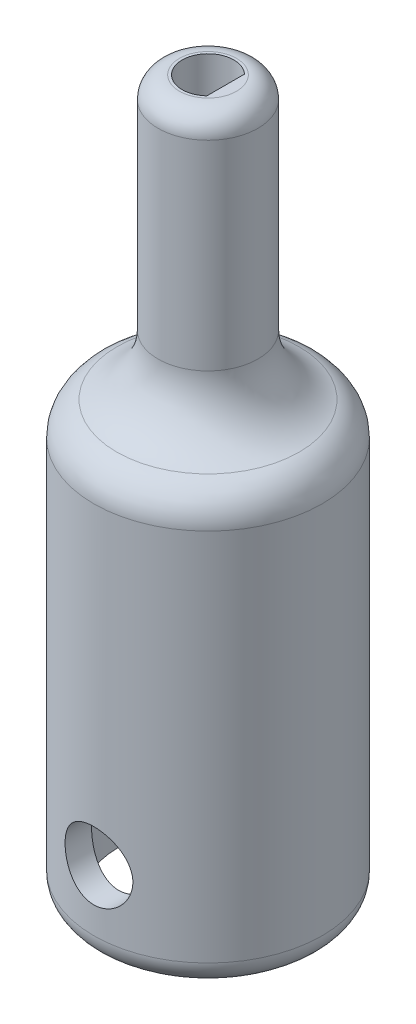
ISO-10303-21;
HEADER;
FILE_DESCRIPTION(('STEP AP214'),'2;1');
FILE_NAME('part.step','',(''),(''),'','','');
FILE_SCHEMA(('AUTOMOTIVE_DESIGN { 1 0 10303 214 1 1 1 1 }'));
ENDSEC;
DATA;
#1=APPLICATION_CONTEXT('core data for automotive mechanical design processes');
#2=APPLICATION_PROTOCOL_DEFINITION('international standard','automotive_design',2000,#1);
#3=PRODUCT_CONTEXT('',#1,'mechanical');
#4=PRODUCT('Part','Part','',(#3));
#5=PRODUCT_RELATED_PRODUCT_CATEGORY('part','',(#4));
#6=PRODUCT_DEFINITION_FORMATION('','',#4);
#7=PRODUCT_DEFINITION_CONTEXT('part definition',#1,'design');
#8=PRODUCT_DEFINITION('design','',#6,#7);
#9=PRODUCT_DEFINITION_SHAPE('','',#8);
#10=(LENGTH_UNIT() NAMED_UNIT(*) SI_UNIT(.MILLI.,.METRE.));
#11=(NAMED_UNIT(*) PLANE_ANGLE_UNIT() SI_UNIT($,.RADIAN.));
#12=(NAMED_UNIT(*) SI_UNIT($,.STERADIAN.) SOLID_ANGLE_UNIT());
#13=UNCERTAINTY_MEASURE_WITH_UNIT(LENGTH_MEASURE(1.E-05),#10,'distance_accuracy_value','');
#14=(GEOMETRIC_REPRESENTATION_CONTEXT(3) GLOBAL_UNCERTAINTY_ASSIGNED_CONTEXT((#13)) GLOBAL_UNIT_ASSIGNED_CONTEXT((#10,
#11,#12)) REPRESENTATION_CONTEXT('',''));
#15=CARTESIAN_POINT('',(0.,0.,0.));
#16=DIRECTION('',(0.,0.,1.));
#17=DIRECTION('',(1.,0.,0.));
#18=AXIS2_PLACEMENT_3D('',#15,#16,#17);
#19=CARTESIAN_POINT('',(0.,100.,6.99999999999999));
#20=DIRECTION('',(0.,-1.,0.));
#21=DIRECTION('',(0.,0.,-1.));
#22=AXIS2_PLACEMENT_3D('',#19,#20,#21);
#23=PLANE('',#22);
#24=CARTESIAN_POINT('',(0.,100.,0.));
#25=DIRECTION('',(0.,-1.,0.));
#26=DIRECTION('',(0.,0.,-1.));
#27=AXIS2_PLACEMENT_3D('',#24,#25,#26);
#28=CIRCLE('',#27,3.99999999999999);
#29=CARTESIAN_POINT('',(0.,100.,-3.99999999999998));
#30=VERTEX_POINT('',#29);
#31=EDGE_CURVE('E50',#30,#30,#28,.F.);
#32=ORIENTED_EDGE('',*,*,#31,.T.);
#33=EDGE_LOOP('',(#32));
#34=FACE_BOUND('',#33,.T.);
#35=DIRECTION('',(0.,0.,1.));
#36=VECTOR('',#35,1.);
#37=CARTESIAN_POINT('',(2.4765,100.,0.));
#38=LINE('',#37,#36);
#39=CARTESIAN_POINT('',(2.4765,100.,-2.63964543073496));
#40=VERTEX_POINT('',#39);
#41=CARTESIAN_POINT('',(2.4765,100.,2.63964543073498));
#42=VERTEX_POINT('',#41);
#43=EDGE_CURVE('E57',#40,#42,#38,.T.);
#44=ORIENTED_EDGE('',*,*,#43,.T.);
#45=CARTESIAN_POINT('',(0.,100.,0.));
#46=DIRECTION('',(0.,1.,0.));
#47=DIRECTION('',(0.,0.,1.));
#48=AXIS2_PLACEMENT_3D('',#45,#46,#47);
#49=CIRCLE('',#48,3.6195);
#50=EDGE_CURVE('E78',#40,#42,#49,.T.);
#51=ORIENTED_EDGE('',*,*,#50,.F.);
#52=EDGE_LOOP('',(#44,#51));
#53=FACE_BOUND('',#52,.T.);
#54=ADVANCED_FACE('F41',(#34,#53),#23,.F.);
#55=CARTESIAN_POINT('',(0.,12.,-16.));
#56=DIRECTION('',(0.,0.,1.));
#57=DIRECTION('',(1.,0.,0.));
#58=AXIS2_PLACEMENT_3D('',#55,#56,#57);
#59=CYLINDRICAL_SURFACE('',#58,4.75);
#60=CARTESIAN_POINT('',(4.75,12.,-11.5623310798472));
#61=CARTESIAN_POINT('',(4.75000071288731,12.1280869020408,-11.5623304254209));
#62=CARTESIAN_POINT('',(4.7448149214157,12.2561643708243,-11.5644651777453));
#63=CARTESIAN_POINT('',(4.72412714696736,12.5113876507321,-11.5729317396174));
#64=CARTESIAN_POINT('',(4.70862187780732,12.6385331520326,-11.579264886119));
#65=CARTESIAN_POINT('',(4.66746528251825,12.890842395101,-11.5959155784243));
#66=CARTESIAN_POINT('',(4.64181854969211,13.0160070074045,-11.6062313203687));
#67=CARTESIAN_POINT('',(4.5806267377214,13.2635769294969,-11.6305176545544));
#68=CARTESIAN_POINT('',(4.54507773323256,13.3859811241899,-11.6444896960506));
#69=CARTESIAN_POINT('',(4.46452814518694,13.6268252220373,-11.6756089732222));
#70=CARTESIAN_POINT('',(4.41955524155441,13.745275582572,-11.6927468929798));
#71=CARTESIAN_POINT('',(4.3204767636278,13.9778736978506,-11.7297175492613));
#72=CARTESIAN_POINT('',(4.26636777388495,14.0920198238979,-11.7495512930536));
#73=CARTESIAN_POINT('',(4.0909401057549,14.4269597626762,-11.8122668719216));
#74=CARTESIAN_POINT('',(3.95646219100749,14.6404288729158,-11.8583867822014));
#75=CARTESIAN_POINT('',(3.64908567349391,15.0521791024374,-11.9566439611443));
#76=CARTESIAN_POINT('',(3.47469277628032,15.2492944236039,-12.0089612145274));
#77=CARTESIAN_POINT('',(3.09554664890728,15.612334674879,-12.1122318297992));
#78=CARTESIAN_POINT('',(2.89078673473612,15.7782527199496,-12.163184888496));
#79=CARTESIAN_POINT('',(2.44788929688681,16.0797764043863,-12.2601358027252));
#80=CARTESIAN_POINT('',(2.20883297897854,16.2141147550826,-12.3058971774678));
#81=CARTESIAN_POINT('',(1.70946510282705,16.4401870767963,-12.3851323728162));
#82=CARTESIAN_POINT('',(1.44916116891328,16.5319362518462,-12.4186105775302));
#83=CARTESIAN_POINT('',(0.92688988664031,16.6661358096678,-12.4682237398679));
#84=CARTESIAN_POINT('',(0.665503968170618,16.7105848968573,-12.485059495406));
#85=CARTESIAN_POINT('',(0.138476755386228,16.7553337079339,-12.5020094614591));
#86=CARTESIAN_POINT('',(-0.127163088412745,16.7556481733575,-12.5021292553223));
#87=CARTESIAN_POINT('',(-0.640808155699206,16.7132691446938,-12.4860757458235));
#88=CARTESIAN_POINT('',(-0.889023882168279,16.6727587926702,-12.4707295003568));
#89=CARTESIAN_POINT('',(-1.37482944554291,16.5535605229271,-12.426558868485));
#90=CARTESIAN_POINT('',(-1.61241852653627,16.474869894007,-12.3977335249276));
#91=CARTESIAN_POINT('',(-2.07437231147144,16.2805619822532,-12.3289238801589));
#92=CARTESIAN_POINT('',(-2.29849173022588,16.1644196593062,-12.2887820027463));
#93=CARTESIAN_POINT('',(-2.72462156537307,15.8989749639529,-12.2013860830293));
#94=CARTESIAN_POINT('',(-2.92662471598682,15.7496617425375,-12.1541297154645));
#95=CARTESIAN_POINT('',(-3.31562610016878,15.4116599420667,-12.0540185807176));
#96=CARTESIAN_POINT('',(-3.50099973099311,15.2211479581578,-12.0009980273846));
#97=CARTESIAN_POINT('',(-3.83778994222189,14.8114440339029,-11.8975828128784));
#98=CARTESIAN_POINT('',(-3.98919751674903,14.5922445115801,-11.8471888508412));
#99=CARTESIAN_POINT('',(-4.25697821457645,14.1248120318153,-11.7536712994445));
#100=CARTESIAN_POINT('',(-4.37245180238396,13.8760211339278,-11.7107447047096));
#101=CARTESIAN_POINT('',(-4.55924307505487,13.3604625638912,-11.63930511263));
#102=CARTESIAN_POINT('',(-4.6305861259122,13.0937053166707,-11.6107838369191));
#103=CARTESIAN_POINT('',(-4.72334557574618,12.5658736413503,-11.5733479765148));
#104=CARTESIAN_POINT('',(-4.74734974893488,12.305326576646,-11.5634187493694));
#105=CARTESIAN_POINT('',(-4.75223220617383,11.7837952454612,-11.5614151455071));
#106=CARTESIAN_POINT('',(-4.73312168952577,11.5228111101093,-11.5693361320885));
#107=CARTESIAN_POINT('',(-4.65466480957691,11.021296446075,-11.6011079451493));
#108=CARTESIAN_POINT('',(-4.5973469962478,10.7803916830837,-11.6241547837493));
#109=CARTESIAN_POINT('',(-4.44667314135973,10.3117397219485,-11.6826189055805));
#110=CARTESIAN_POINT('',(-4.35330959666755,10.0839952745574,-11.7180387641832));
#111=CARTESIAN_POINT('',(-4.12918416347568,9.63846025915535,-11.7989192486121));
#112=CARTESIAN_POINT('',(-3.99713208257815,9.42138029042404,-11.8447112161964));
#113=CARTESIAN_POINT('',(-3.70078128083387,9.01156214612273,-11.9406231277081));
#114=CARTESIAN_POINT('',(-3.53647048674256,8.81883312873706,-11.9907446880968));
#115=CARTESIAN_POINT('',(-3.16739381048829,8.45001095864917,-12.0936554251922));
#116=CARTESIAN_POINT('',(-2.96068480944307,8.27583043258979,-12.1464046574282));
#117=CARTESIAN_POINT('',(-2.63019992960076,8.04237114448173,-12.2206748400947));
#118=CARTESIAN_POINT('',(-2.51656379211843,7.96915267835017,-12.2446349535557));
#119=CARTESIAN_POINT('',(-2.28313914021767,7.83250286763495,-12.290296303524));
#120=CARTESIAN_POINT('',(-2.16335329195171,7.76906732871977,-12.3119985067819));
#121=CARTESIAN_POINT('',(-1.9186988342614,7.6526548424002,-12.3524871050923));
#122=CARTESIAN_POINT('',(-1.79384323116981,7.59965294857478,-12.371280431556));
#123=CARTESIAN_POINT('',(-1.53969226563594,7.50441870759753,-12.4054736153239));
#124=CARTESIAN_POINT('',(-1.41039879218218,7.46218184124033,-12.4208748962533));
#125=CARTESIAN_POINT('',(-1.14831363151065,7.38888430085658,-12.447840204455));
#126=CARTESIAN_POINT('',(-1.01552260170574,7.35782154236937,-12.4594049473783));
#127=CARTESIAN_POINT('',(-0.747473649748549,7.30719885306018,-12.4783544591522));
#128=CARTESIAN_POINT('',(-0.612215874736863,7.28763823843761,-12.4857394764858));
#129=CARTESIAN_POINT('',(-0.348499213010656,7.26106062624677,-12.4957955503732));
#130=CARTESIAN_POINT('',(-0.220118272166205,7.25336256573471,-12.4987224321008));
#131=CARTESIAN_POINT('',(0.0369201903970496,7.24840399515189,-12.5006063281555));
#132=CARTESIAN_POINT('',(0.16557779091261,7.25114701270687,-12.4995620007689));
#133=CARTESIAN_POINT('',(0.422089221076055,7.26704685728794,-12.4935299945745));
#134=CARTESIAN_POINT('',(0.549943417527919,7.28019852169471,-12.4885442706744));
#135=CARTESIAN_POINT('',(0.804010374388073,7.3167802014355,-12.4747649877962));
#136=CARTESIAN_POINT('',(0.930222504047261,7.34021405293404,-12.4659700076447));
#137=CARTESIAN_POINT('',(1.17680322833963,7.39639272731648,-12.4450808238561));
#138=CARTESIAN_POINT('',(1.29723841813188,7.42887937077359,-12.4330784356576));
#139=CARTESIAN_POINT('',(1.53488438084163,7.50309546015174,-12.405985163339));
#140=CARTESIAN_POINT('',(1.65209400085175,7.54482816384496,-12.3908931907723));
#141=CARTESIAN_POINT('',(1.99771775784392,7.68339029683333,-12.3415189105825));
#142=CARTESIAN_POINT('',(2.22033027729863,7.79363055773921,-12.3031200975229));
#143=CARTESIAN_POINT('',(2.65361303882081,8.05193544379701,-12.2171729879033));
#144=CARTESIAN_POINT('',(2.86337265277402,8.20140939297999,-12.1693050079323));
#145=CARTESIAN_POINT('',(3.25568144515618,8.5317359240797,-12.0702737213519));
#146=CARTESIAN_POINT('',(3.4382207660578,8.71259982245923,-12.0191092305069));
#147=CARTESIAN_POINT('',(3.78120797202441,9.11244823309505,-11.9158013491762));
#148=CARTESIAN_POINT('',(3.93990805238812,9.33297382373113,-11.8637567589751));
#149=CARTESIAN_POINT('',(4.14844117642505,9.68236733780885,-11.7917707985346));
#150=CARTESIAN_POINT('',(4.21306556059525,9.80201770982947,-11.7687758185953));
#151=CARTESIAN_POINT('',(4.33197597476051,10.0468059288026,-11.7255270049279));
#152=CARTESIAN_POINT('',(4.38626638227117,10.1719414244731,-11.7052720115868));
#153=CARTESIAN_POINT('',(4.48675686236488,10.4340170835188,-11.6671362488721));
#154=CARTESIAN_POINT('',(4.53233262376227,10.5712257271603,-11.6494522825914));
#155=CARTESIAN_POINT('',(4.61086600075328,10.8496428451747,-11.6185927345741));
#156=CARTESIAN_POINT('',(4.64382935515268,10.9908494689283,-11.6054151026887));
#157=CARTESIAN_POINT('',(4.69673911656839,11.2760086939846,-11.5841036638395));
#158=CARTESIAN_POINT('',(4.71669006258537,11.4199603197201,-11.5759680981466));
#159=CARTESIAN_POINT('',(4.74331921351786,11.7092788074202,-11.5650825370967));
#160=CARTESIAN_POINT('',(4.7499991910071,11.8546454777738,-11.5623318224978));
#161=CARTESIAN_POINT('',(4.75,12.,-11.5623310798472));
#162=B_SPLINE_CURVE_WITH_KNOTS('',3,(#60,#61,#62,#63,#64,#65,#66,#67,#68,#69,#70,#71,#72,#73,
#74,#75,#76,#77,#78,#79,#80,#81,#82,#83,#84,#85,#86,#87,#88,#89,#90,#91,#92,#93,#94,#95,#96,#97,
#98,#99,#100,#101,#102,#103,#104,#105,#106,#107,#108,#109,#110,#111,#112,#113,#114,#115,#116,
#117,#118,#119,#120,#121,#122,#123,#124,#125,#126,#127,#128,#129,#130,#131,#132,#133,#134,#135,
#136,#137,#138,#139,#140,#141,#142,#143,#144,#145,#146,#147,#148,#149,#150,#151,#152,#153,#154,
#155,#156,#157,#158,#159,#160,#161),.UNSPECIFIED.,.T.,.F.,(4,2,2,2,2,2,2,2,2,2,2,2,2,2,2,2,2,2,
2,2,2,2,2,2,2,2,2,2,2,2,2,2,2,2,2,2,2,2,2,2,2,2,2,2,2,2,2,2,2,2,4),(0.,0.384122452894618,
0.768367286126422,1.15243828497943,1.53666175002388,1.91977210573404,2.303026002422,
3.06898568409038,3.87051838444686,4.67222777081633,5.50205633862985,6.3315884352899,
7.12447650700119,7.91709974317398,8.66947340979513,9.42190051066893,10.1853713906225,
10.9490923430524,11.7585800260723,12.5682820864396,13.3968701160663,14.2249814341312,
15.0064100040571,15.7876356165525,16.5303750953206,17.2732692631547,18.0444883789579,
18.8159966857218,19.6379673188466,20.049424237456,20.460704254667,20.8709886447164,
21.2811005108379,21.691135833408,22.1011467769794,22.486602729165,22.8721889231711,
23.2575839887654,23.6431229632038,24.018628665334,24.394266884771,25.1449219904715,
25.9275039487996,26.7103686258297,27.5359298888771,27.9492557495771,28.3624061321638,
28.7987220165448,29.2348391348787,29.670804044948,30.1067107202385),.UNSPECIFIED.);
#163=CARTESIAN_POINT('',(4.75,12.,-11.5623310798472));
#164=VERTEX_POINT('',#163);
#165=EDGE_CURVE('E104',#164,#164,#162,.T.);
#166=ORIENTED_EDGE('',*,*,#165,.T.);
#167=EDGE_LOOP('',(#166));
#168=FACE_BOUND('',#167,.T.);
#169=CARTESIAN_POINT('',(0.,16.75,-16.));
#170=CARTESIAN_POINT('',(-0.26070567225133,16.749996505252,-15.9999975519953));
#171=CARTESIAN_POINT('',(-0.521446746347982,16.7284653470622,-15.9935669595937));
#172=CARTESIAN_POINT('',(-1.03534382961395,16.643108860596,-15.9685419064033));
#173=CARTESIAN_POINT('',(-1.28849741549849,16.5792701675057,-15.9499436018973));
#174=CARTESIAN_POINT('',(-1.77973256832612,16.4116121514142,-15.9026224603528));
#175=CARTESIAN_POINT('',(-2.01783551561075,16.3078510975144,-15.8739143842874));
#176=CARTESIAN_POINT('',(-2.47326350270938,16.0635304859457,-15.8093624290536));
#177=CARTESIAN_POINT('',(-2.69058590229262,15.9229662607822,-15.7735176449238));
#178=CARTESIAN_POINT('',(-3.10440680678848,15.6048556123274,-15.6973909801758));
#179=CARTESIAN_POINT('',(-3.30023708479862,15.4264613780274,-15.6570195975014));
#180=CARTESIAN_POINT('',(-3.65968676646443,15.0395621287212,-15.5769276396439));
#181=CARTESIAN_POINT('',(-3.82330088512709,14.8310521830057,-15.5372071722202));
#182=CARTESIAN_POINT('',(-4.11716450848363,14.3842178866056,-15.4619706119089));
#183=CARTESIAN_POINT('',(-4.24660302867083,14.1453396714778,-15.4265659133499));
#184=CARTESIAN_POINT('',(-4.4632005458223,13.647986272125,-15.3653051205624));
#185=CARTESIAN_POINT('',(-4.55036945816789,13.3895157002369,-15.3394467873381));
#186=CARTESIAN_POINT('',(-4.67755245924913,12.8678086738504,-15.3011383581976));
#187=CARTESIAN_POINT('',(-4.71879654659294,12.6048983743032,-15.2883393281079));
#188=CARTESIAN_POINT('',(-4.75679940907518,12.0756023982679,-15.2765601689967));
#189=CARTESIAN_POINT('',(-4.75356871171795,11.809217559143,-15.2775767697143));
#190=CARTESIAN_POINT('',(-4.70368083478542,11.2904958328331,-15.293004451461));
#191=CARTESIAN_POINT('',(-4.65855928412517,11.0379948453399,-15.3069418575055));
#192=CARTESIAN_POINT('',(-4.52864948410571,10.5443213349658,-15.3458752241279));
#193=CARTESIAN_POINT('',(-4.44385739326104,10.3031499116694,-15.3708722556488));
#194=CARTESIAN_POINT('',(-4.23587077025775,9.83520132596099,-15.4294900694923));
#195=CARTESIAN_POINT('',(-4.11217428778469,9.60866184394449,-15.4632224901811));
#196=CARTESIAN_POINT('',(-3.83023914738897,9.17903839104181,-15.5354560108813));
#197=CARTESIAN_POINT('',(-3.67199226801561,8.97596002046942,-15.5739582449503));
#198=CARTESIAN_POINT('',(-3.31779954943057,8.59030709279969,-15.65331921222));
#199=CARTESIAN_POINT('',(-3.12057779220426,8.40890897641407,-15.6942099593235));
#200=CARTESIAN_POINT('',(-2.69800471257564,8.08149065903697,-15.7723452641626));
#201=CARTESIAN_POINT('',(-2.47265169328005,7.93547259375371,-15.8095896017027));
#202=CARTESIAN_POINT('',(-1.99810619878083,7.68226479314308,-15.8765639236345));
#203=CARTESIAN_POINT('',(-1.74876948190873,7.57533128827071,-15.906243947348));
#204=CARTESIAN_POINT('',(-1.23456606273388,7.40526135569564,-15.9543855050516));
#205=CARTESIAN_POINT('',(-0.969703620285577,7.3421129749336,-15.9728501006113));
#206=CARTESIAN_POINT('',(-0.441972179887557,7.26335340474478,-15.9959981723728));
#207=CARTESIAN_POINT('',(-0.179361120122493,7.24614732482477,-16.001143814837));
#208=CARTESIAN_POINT('',(0.345010859131308,7.25529698660518,-15.9984274349598));
#209=CARTESIAN_POINT('',(0.6067718850658,7.28164704518619,-15.9905671096115));
#210=CARTESIAN_POINT('',(1.11602587705413,7.37586935368988,-15.963024189988));
#211=CARTESIAN_POINT('',(1.36370614656555,7.44281382860126,-15.9436059271776));
#212=CARTESIAN_POINT('',(1.84426867680972,7.6152122540717,-15.8951895518284));
#213=CARTESIAN_POINT('',(2.07714916860728,7.72067079787818,-15.8661902966851));
#214=CARTESIAN_POINT('',(2.52740235735572,7.96980820108433,-15.8007977780301));
#215=CARTESIAN_POINT('',(2.74430003031691,8.11430415522023,-15.7642509164929));
#216=CARTESIAN_POINT('',(3.15131425239062,8.43641854794157,-15.6879625552353));
#217=CARTESIAN_POINT('',(3.34142420510143,8.61404511991454,-15.6482202724222));
#218=CARTESIAN_POINT('',(3.69646044519739,9.0048685154705,-15.5682533225203));
#219=CARTESIAN_POINT('',(3.8602527122982,9.21910447484586,-15.528061641048));
#220=CARTESIAN_POINT('',(4.14963592215259,9.67289356112625,-15.4532502110458));
#221=CARTESIAN_POINT('',(4.27522794889976,9.91244596937613,-15.418630304421));
#222=CARTESIAN_POINT('',(4.48377155212868,10.4092487527008,-15.3592826735014));
#223=CARTESIAN_POINT('',(4.56692867767943,10.6664068369479,-15.3345073949411));
#224=CARTESIAN_POINT('',(4.68852081695,11.1919455059316,-15.2977738553872));
#225=CARTESIAN_POINT('',(4.72697075435237,11.4603223147435,-15.2858113174847));
#226=CARTESIAN_POINT('',(4.75705699216789,11.9889170225052,-15.2764729540938));
#227=CARTESIAN_POINT('',(4.75053917233241,12.2490210892304,-15.2785219387526));
#228=CARTESIAN_POINT('',(4.69526883350326,12.7642464555219,-15.2955963824404));
#229=CARTESIAN_POINT('',(4.64651794090663,13.0193679465804,-15.3106213417642));
#230=CARTESIAN_POINT('',(4.50934571485169,13.5144373863661,-15.3515730206474));
#231=CARTESIAN_POINT('',(4.42140352609225,13.7545298087871,-15.3773678366717));
#232=CARTESIAN_POINT('',(4.2087173753822,14.2167436944162,-15.4369310074602));
#233=CARTESIAN_POINT('',(4.08396648353459,14.4388617635877,-15.4707008634293));
#234=CARTESIAN_POINT('',(3.79597895299047,14.8674120748939,-15.5439163797675));
#235=CARTESIAN_POINT('',(3.63152566195092,15.0729994262672,-15.5835218151215));
#236=CARTESIAN_POINT('',(3.27100354910397,15.4542580760204,-15.6631594560472));
#237=CARTESIAN_POINT('',(3.07492658310786,15.6299216439655,-15.7031917690679));
#238=CARTESIAN_POINT('',(2.65000924997735,15.9513160166139,-15.7805364476621));
#239=CARTESIAN_POINT('',(2.42039606417665,16.0960541506291,-15.8177391660193));
#240=CARTESIAN_POINT('',(1.93898955829397,16.3446660238058,-15.8839288844265));
#241=CARTESIAN_POINT('',(1.68720707973512,16.4485596029533,-15.9129198713559));
#242=CARTESIAN_POINT('',(1.1979150483489,16.6027938590764,-15.9567666019116));
#243=CARTESIAN_POINT('',(0.961992664332182,16.6578487795024,-15.9728467644627));
#244=CARTESIAN_POINT('',(0.484056374283711,16.7314505652029,-15.9944637603522));
#245=CARTESIAN_POINT('',(0.242043444579143,16.7500032445817,-16.0000022727679));
#246=CARTESIAN_POINT('',(0.,16.75,-16.));
#247=B_SPLINE_CURVE_WITH_KNOTS('',3,(#169,#170,#171,#172,#173,#174,#175,#176,#177,#178,#179,
#180,#181,#182,#183,#184,#185,#186,#187,#188,#189,#190,#191,#192,#193,#194,#195,#196,#197,#198,
#199,#200,#201,#202,#203,#204,#205,#206,#207,#208,#209,#210,#211,#212,#213,#214,#215,#216,#217,
#218,#219,#220,#221,#222,#223,#224,#225,#226,#227,#228,#229,#230,#231,#232,#233,#234,#235,#236,
#237,#238,#239,#240,#241,#242,#243,#244,#245,#246),.UNSPECIFIED.,.T.,.F.,(4,2,2,2,2,2,2,2,2,2,2,
2,2,2,2,2,2,2,2,2,2,2,2,2,2,2,2,2,2,2,2,2,2,2,2,2,2,2,4),(0.,0.781228080531369,1.56270306620222,
2.34304174243283,3.12347943165774,3.9237180006734,4.72408773796652,5.54202167345277,
6.35976364939135,7.15503388870292,7.95011588501446,8.71715610449882,9.48427061548251,
10.2617193097326,11.039353204052,11.8487529919314,12.6582016268671,13.4728654993288,
14.2873068860988,15.0730832487222,15.8587570928816,16.6271178870783,17.3955703471121,
18.1815548651501,18.9677325927114,19.7818280454392,20.5959003947364,21.4059911353541,
22.2158113823112,22.9925930274858,23.7693447601032,24.53685004932,25.3044999274402,
26.0995991652974,26.8949034966066,27.7128123439618,28.5303234048915,29.2557439904769,
29.9810490211687),.UNSPECIFIED.);
#248=CARTESIAN_POINT('',(0.,16.75,-16.));
#249=VERTEX_POINT('',#248);
#250=EDGE_CURVE('E113',#249,#249,#247,.T.);
#251=ORIENTED_EDGE('',*,*,#250,.F.);
#252=EDGE_LOOP('',(#251));
#253=FACE_BOUND('',#252,.T.);
#254=ADVANCED_FACE('F130',(#168,#253),#59,.F.);
#255=CARTESIAN_POINT('',(0.,2.41146554148117,0.));
#256=DIRECTION('',(0.,-1.,0.));
#257=DIRECTION('',(0.,0.,-1.));
#258=AXIS2_PLACEMENT_3D('',#255,#256,#257);
#259=CYLINDRICAL_SURFACE('',#258,16.);
#260=CARTESIAN_POINT('',(0.,3.5,0.));
#261=DIRECTION('',(0.,1.,0.));
#262=DIRECTION('',(0.,0.,1.));
#263=AXIS2_PLACEMENT_3D('',#260,#261,#262);
#264=CIRCLE('',#263,16.);
#265=CARTESIAN_POINT('',(0.,3.5,16.));
#266=VERTEX_POINT('',#265);
#267=EDGE_CURVE('E11',#266,#266,#264,.T.);
#268=ORIENTED_EDGE('',*,*,#267,.T.);
#269=EDGE_LOOP('',(#268));
#270=FACE_BOUND('',#269,.T.);
#271=CARTESIAN_POINT('',(0.,55.923303169378,0.));
#272=DIRECTION('',(0.,1.,0.));
#273=DIRECTION('',(0.,0.,1.));
#274=AXIS2_PLACEMENT_3D('',#271,#272,#273);
#275=CIRCLE('',#274,16.);
#276=CARTESIAN_POINT('',(0.,55.923303169378,16.));
#277=VERTEX_POINT('',#276);
#278=EDGE_CURVE('E149',#277,#277,#275,.F.);
#279=ORIENTED_EDGE('',*,*,#278,.T.);
#280=EDGE_LOOP('',(#279));
#281=FACE_BOUND('',#280,.T.);
#282=ORIENTED_EDGE('',*,*,#250,.T.);
#283=EDGE_LOOP('',(#282));
#284=FACE_BOUND('',#283,.T.);
#285=CARTESIAN_POINT('',(4.75,12.,15.2786615905975));
#286=CARTESIAN_POINT('',(4.74999641854889,11.739580090942,15.2786645173645));
#287=CARTESIAN_POINT('',(4.7285107697107,11.4791246564979,15.2853926080842));
#288=CARTESIAN_POINT('',(4.64335141783791,10.9658193412336,15.3114732297201));
#289=CARTESIAN_POINT('',(4.57966294581232,10.7129721553348,15.330830180103));
#290=CARTESIAN_POINT('',(4.41244372211199,10.2223879306895,15.3797871680349));
#291=CARTESIAN_POINT('',(4.3089782126668,9.98462688778896,15.4093704244432));
#292=CARTESIAN_POINT('',(4.06535541836592,9.52978103918896,15.4754241552602));
#293=CARTESIAN_POINT('',(3.92519288913005,9.3126991948113,15.5118956138557));
#294=CARTESIAN_POINT('',(3.60750462533337,8.89864638159834,15.5888838768353));
#295=CARTESIAN_POINT('',(3.42904051428651,8.7024110008328,15.6294854992601));
#296=CARTESIAN_POINT('',(3.04182670085581,8.34216827237017,15.7094340333983));
#297=CARTESIAN_POINT('',(2.83307319036506,8.17816498313663,15.7487807865844));
#298=CARTESIAN_POINT('',(2.38598645410466,7.88386021171852,15.8227480588905));
#299=CARTESIAN_POINT('',(2.14714064681258,7.75430690480543,15.8572569780342));
#300=CARTESIAN_POINT('',(1.64985490681774,7.53748864288187,15.9166761248566));
#301=CARTESIAN_POINT('',(1.39141912130537,7.45021476608734,15.9415883773916));
#302=CARTESIAN_POINT('',(0.869983468262371,7.322861767209,15.9784071517873));
#303=CARTESIAN_POINT('',(0.607314972659609,7.28152747403075,15.9906588903769));
#304=CARTESIAN_POINT('',(0.0785047391751729,7.24326005680844,16.0019910678025));
#305=CARTESIAN_POINT('',(-0.187636272543758,7.24631779372414,16.0010742176719));
#306=CARTESIAN_POINT('',(-0.70703795205952,7.29590104801031,15.9864174221246));
#307=CARTESIAN_POINT('',(-0.960441435579815,7.34106764372439,15.9730783761365));
#308=CARTESIAN_POINT('',(-1.45589494946967,7.4713691060813,15.9355618093429));
#309=CARTESIAN_POINT('',(-1.69794426562789,7.55650648330846,15.9113836077291));
#310=CARTESIAN_POINT('',(-2.16707213906577,7.76526459952473,15.8543472469233));
#311=CARTESIAN_POINT('',(-2.39394664070741,7.88931642590784,15.8213925129053));
#312=CARTESIAN_POINT('',(-2.82409629737654,8.17204213414847,15.7503041145677));
#313=CARTESIAN_POINT('',(-3.02736592972959,8.3307240932843,15.7121692427958));
#314=CARTESIAN_POINT('',(-3.41264640960057,8.68527029371763,15.6331062812896));
#315=CARTESIAN_POINT('',(-3.59356389794358,8.88231283836387,15.5921270949345));
#316=CARTESIAN_POINT('',(-3.92009230342504,9.30434298736925,15.513257816819));
#317=CARTESIAN_POINT('',(-4.06569986143258,9.52933324739497,15.4753680191881));
#318=CARTESIAN_POINT('',(-4.31858398471056,10.003700224204,15.4067269107937));
#319=CARTESIAN_POINT('',(-4.42549479859777,10.2532826391908,15.3760446305243));
#320=CARTESIAN_POINT('',(-4.59544870698651,10.7680300153456,15.326114547779));
#321=CARTESIAN_POINT('',(-4.65850576393499,11.0331899876428,15.3068631061633));
#322=CARTESIAN_POINT('',(-4.73693430858106,11.5611770988712,15.2827708782258));
#323=CARTESIAN_POINT('',(-4.75396478109954,11.8237351501568,15.2774290053089));
#324=CARTESIAN_POINT('',(-4.7444834999416,12.3479630086215,15.2803765482744));
#325=CARTESIAN_POINT('',(-4.7179776909966,12.6096329321827,15.2886641031049));
#326=CARTESIAN_POINT('',(-4.62365233727752,13.1177901232036,15.3174456386117));
#327=CARTESIAN_POINT('',(-4.55689414663765,13.3644939807784,15.337625743379));
#328=CARTESIAN_POINT('',(-4.38518600677873,13.8431847028981,15.3875952093814));
#329=CARTESIAN_POINT('',(-4.28023024458843,14.0751693211306,15.4173860331136));
#330=CARTESIAN_POINT('',(-4.03193811599809,14.5246026467549,15.4841975033031));
#331=CARTESIAN_POINT('',(-3.88766230382657,14.7415064539444,15.5213881417126));
#332=CARTESIAN_POINT('',(-3.56594588634719,15.1486314868138,15.5984403431881));
#333=CARTESIAN_POINT('',(-3.38849750944012,15.3388464415673,15.6383025307323));
#334=CARTESIAN_POINT('',(-2.99768568992657,15.6944140993997,15.7179840887381));
#335=CARTESIAN_POINT('',(-2.7832397719804,15.8585923886911,15.7577477560257));
#336=CARTESIAN_POINT('',(-2.32889779786996,16.1486574181371,15.8312701059571));
#337=CARTESIAN_POINT('',(-2.08900302488176,16.2745460876852,15.8650290911381));
#338=CARTESIAN_POINT('',(-1.59217911743711,16.4832448811888,15.92252983886));
#339=CARTESIAN_POINT('',(-1.33539490236169,16.5663783157513,15.9463465176887));
#340=CARTESIAN_POINT('',(-0.810668835250017,16.6880482175411,15.9816100486085));
#341=CARTESIAN_POINT('',(-0.542730125036346,16.726597155753,15.9930603597077));
#342=CARTESIAN_POINT('',(-0.0141651106964231,16.7570714225938,16.0020950205076));
#343=CARTESIAN_POINT('',(0.246355468576461,16.7507016506211,16.0001864312102));
#344=CARTESIAN_POINT('',(0.762454544364329,16.6955834582788,15.9839080902851));
#345=CARTESIAN_POINT('',(1.01803331038797,16.6468373556627,15.9695390201776));
#346=CARTESIAN_POINT('',(1.51443061257727,16.5093973009892,15.9300947041604));
#347=CARTESIAN_POINT('',(1.75537430340128,16.4211210132153,15.9051315329862));
#348=CARTESIAN_POINT('',(2.21915834770546,16.2074993987947,15.8470824093003));
#349=CARTESIAN_POINT('',(2.44199575432977,16.0821480534064,15.8139951380755));
#350=CARTESIAN_POINT('',(2.87087104192842,15.7933526154101,15.7418837847465));
#351=CARTESIAN_POINT('',(3.07615838393368,15.6288327427385,15.7027054935308));
#352=CARTESIAN_POINT('',(3.45678250850066,15.2683176333224,15.6233329304477));
#353=CARTESIAN_POINT('',(3.63211071507647,15.0723134150377,15.5831383714346));
#354=CARTESIAN_POINT('',(3.95294104513819,14.6475683065621,15.5049142454633));
#355=CARTESIAN_POINT('',(4.09743050109273,14.4180427534805,15.4669812961403));
#356=CARTESIAN_POINT('',(4.34559860700621,13.9368693638951,15.3991046133859));
#357=CARTESIAN_POINT('',(4.44929760118009,13.6852326321374,15.3691568997308));
#358=CARTESIAN_POINT('',(4.60317188552907,13.1963879816347,15.3237232087146));
#359=CARTESIAN_POINT('',(4.65808304802854,12.9607794999069,15.3069824340255));
#360=CARTESIAN_POINT('',(4.73149530289636,12.4834567690756,15.2844513085357));
#361=CARTESIAN_POINT('',(4.75000332460453,12.2417436908561,15.2786588737259));
#362=CARTESIAN_POINT('',(4.75,12.,15.2786615905975));
#363=B_SPLINE_CURVE_WITH_KNOTS('',3,(#285,#286,#287,#288,#289,#290,#291,#292,#293,#294,#295,
#296,#297,#298,#299,#300,#301,#302,#303,#304,#305,#306,#307,#308,#309,#310,#311,#312,#313,#314,
#315,#316,#317,#318,#319,#320,#321,#322,#323,#324,#325,#326,#327,#328,#329,#330,#331,#332,#333,
#334,#335,#336,#337,#338,#339,#340,#341,#342,#343,#344,#345,#346,#347,#348,#349,#350,#351,#352,
#353,#354,#355,#356,#357,#358,#359,#360,#361,#362),.UNSPECIFIED.,.T.,.F.,(4,2,2,2,2,2,2,2,2,2,2,
2,2,2,2,2,2,2,2,2,2,2,2,2,2,2,2,2,2,2,2,2,2,2,2,2,2,2,4),(0.,0.780368259325989,1.56100975494018,
2.34037626906025,3.11985422349443,3.92121288680706,4.72267238764021,5.54033088681321,
6.35781676886239,7.15237167852797,7.94676301454554,8.71637388280035,9.48603309715861,
10.2645389284776,11.0432265362218,11.8513344453354,12.6595192018474,13.4751546684174,
14.290530328581,15.0760980392268,15.8615584921862,16.6271624385556,17.392882944585,
18.178803265023,18.9649079405045,19.7799794136835,20.5950098090405,21.4037828985514,
22.2123297067609,22.9903577057638,23.7683431535663,24.5382957851863,25.3083734791039,
26.1027147004491,26.8972829272856,27.7148987998643,28.5321063684634,29.2566478353603,
29.9810513723972),.UNSPECIFIED.);
#364=CARTESIAN_POINT('',(4.75,12.,15.2786615905975));
#365=VERTEX_POINT('',#364);
#366=EDGE_CURVE('E103',#365,#365,#363,.T.);
#367=ORIENTED_EDGE('',*,*,#366,.T.);
#368=EDGE_LOOP('',(#367));
#369=FACE_BOUND('',#368,.T.);
#370=ADVANCED_FACE('F118',(#270,#281,#284,#369),#259,.T.);
#371=CARTESIAN_POINT('',(0.,69.,0.));
#372=DIRECTION('',(0.,-1.,0.));
#373=DIRECTION('',(0.,0.,-1.));
#374=AXIS2_PLACEMENT_3D('',#371,#372,#373);
#375=TOROIDAL_SURFACE('',#374,16.,8.99999999999999);
#376=CARTESIAN_POINT('',(0.,60.5935520374572,0.));
#377=DIRECTION('',(0.,1.,0.));
#378=DIRECTION('',(0.,0.,1.));
#379=AXIS2_PLACEMENT_3D('',#376,#377,#378);
#380=CIRCLE('',#379,12.7857142857143);
#381=CARTESIAN_POINT('',(0.,60.5935520374572,12.7857142857143));
#382=VERTEX_POINT('',#381);
#383=EDGE_CURVE('E153',#382,#382,#380,.T.);
#384=ORIENTED_EDGE('',*,*,#383,.T.);
#385=EDGE_LOOP('',(#384));
#386=FACE_BOUND('',#385,.T.);
#387=CARTESIAN_POINT('',(0.,69.,0.));
#388=DIRECTION('',(0.,-1.,0.));
#389=DIRECTION('',(0.,0.,-1.));
#390=AXIS2_PLACEMENT_3D('',#387,#388,#389);
#391=CIRCLE('',#390,6.99999999999999);
#392=CARTESIAN_POINT('',(0.,69.,-6.99999999999999));
#393=VERTEX_POINT('',#392);
#394=EDGE_CURVE('E99',#393,#393,#391,.T.);
#395=ORIENTED_EDGE('',*,*,#394,.T.);
#396=EDGE_LOOP('',(#395));
#397=FACE_BOUND('',#396,.T.);
#398=ADVANCED_FACE('F173',(#386,#397),#375,.F.);
#399=CARTESIAN_POINT('',(0.,2.41146554148117,0.));
#400=DIRECTION('',(0.,-1.,0.));
#401=DIRECTION('',(0.,0.,-1.));
#402=AXIS2_PLACEMENT_3D('',#399,#400,#401);
#403=CYLINDRICAL_SURFACE('',#402,6.99999999999999);
#404=CARTESIAN_POINT('',(0.,97.,0.));
#405=DIRECTION('',(0.,-1.,0.));
#406=DIRECTION('',(0.,0.,-1.));
#407=AXIS2_PLACEMENT_3D('',#404,#405,#406);
#408=CIRCLE('',#407,6.99999999999999);
#409=CARTESIAN_POINT('',(0.,97.,-6.99999999999998));
#410=VERTEX_POINT('',#409);
#411=EDGE_CURVE('E157',#410,#410,#408,.T.);
#412=ORIENTED_EDGE('',*,*,#411,.T.);
#413=EDGE_LOOP('',(#412));
#414=FACE_BOUND('',#413,.T.);
#415=ORIENTED_EDGE('',*,*,#394,.F.);
#416=EDGE_LOOP('',(#415));
#417=FACE_BOUND('',#416,.T.);
#418=ADVANCED_FACE('F128',(#414,#417),#403,.T.);
#419=CARTESIAN_POINT('',(4.75,12.,11.5623310798472));
#420=CARTESIAN_POINT('',(4.75000071288731,11.8719130979592,11.5623304254209));
#421=CARTESIAN_POINT('',(4.7448149214157,11.7438356291757,11.5644651777453));
#422=CARTESIAN_POINT('',(4.72412714696736,11.4886123492679,11.5729317396174));
#423=CARTESIAN_POINT('',(4.70862187780732,11.3614668479674,11.579264886119));
#424=CARTESIAN_POINT('',(4.66746528251825,11.109157604899,11.5959155784243));
#425=CARTESIAN_POINT('',(4.64181854969211,10.9839929925955,11.6062313203687));
#426=CARTESIAN_POINT('',(4.5806267377214,10.7364230705032,11.6305176545544));
#427=CARTESIAN_POINT('',(4.54507773323256,10.6140188758101,11.6444896960506));
#428=CARTESIAN_POINT('',(4.46452814518694,10.3731747779627,11.6756089732222));
#429=CARTESIAN_POINT('',(4.41955524155441,10.254724417428,11.6927468929798));
#430=CARTESIAN_POINT('',(4.3204767636278,10.0221263021494,11.7297175492613));
#431=CARTESIAN_POINT('',(4.26636777388495,9.90798017610215,11.7495512930536));
#432=CARTESIAN_POINT('',(4.0909401057549,9.57304023732385,11.8122668719216));
#433=CARTESIAN_POINT('',(3.95646219100749,9.3595711270842,11.8583867822014));
#434=CARTESIAN_POINT('',(3.64908567349391,8.94782089756259,11.9566439611443));
#435=CARTESIAN_POINT('',(3.47469277628032,8.7507055763961,12.0089612145274));
#436=CARTESIAN_POINT('',(3.09554664890728,8.38766532512102,12.1122318297992));
#437=CARTESIAN_POINT('',(2.89078673473612,8.22174728005036,12.163184888496));
#438=CARTESIAN_POINT('',(2.44788929688681,7.92022359561367,12.2601358027252));
#439=CARTESIAN_POINT('',(2.20883297897854,7.7858852449174,12.3058971774678));
#440=CARTESIAN_POINT('',(1.70946510282705,7.55981292320373,12.3851323728162));
#441=CARTESIAN_POINT('',(1.44916116891328,7.46806374815382,12.4186105775302));
#442=CARTESIAN_POINT('',(0.926889886640312,7.33386419033223,12.4682237398679));
#443=CARTESIAN_POINT('',(0.66550396817062,7.28941510314273,12.485059495406));
#444=CARTESIAN_POINT('',(0.138476755386228,7.24466629206613,12.5020094614591));
#445=CARTESIAN_POINT('',(-0.127163088412746,7.24435182664248,12.5021292553223));
#446=CARTESIAN_POINT('',(-0.640808155699208,7.2867308553062,12.4860757458235));
#447=CARTESIAN_POINT('',(-0.88902388216828,7.32724120732982,12.4707295003568));
#448=CARTESIAN_POINT('',(-1.37482944554291,7.44643947707288,12.426558868485));
#449=CARTESIAN_POINT('',(-1.61241852653627,7.52513010599296,12.3977335249276));
#450=CARTESIAN_POINT('',(-2.07437231147144,7.71943801774683,12.3289238801589));
#451=CARTESIAN_POINT('',(-2.29849173022588,7.83558034069377,12.2887820027463));
#452=CARTESIAN_POINT('',(-2.72462156537308,8.10102503604711,12.2013860830293));
#453=CARTESIAN_POINT('',(-2.92662471598682,8.25033825746246,12.1541297154645));
#454=CARTESIAN_POINT('',(-3.31562610016878,8.58834005793329,12.0540185807176));
#455=CARTESIAN_POINT('',(-3.50099973099311,8.77885204184221,12.0009980273846));
#456=CARTESIAN_POINT('',(-3.83778994222189,9.18855596609708,11.8975828128784));
#457=CARTESIAN_POINT('',(-3.98919751674904,9.40775548841991,11.8471888508412));
#458=CARTESIAN_POINT('',(-4.25697821457645,9.87518796818466,11.7536712994445));
#459=CARTESIAN_POINT('',(-4.37245180238396,10.1239788660722,11.7107447047096));
#460=CARTESIAN_POINT('',(-4.55924307505487,10.6395374361089,11.63930511263));
#461=CARTESIAN_POINT('',(-4.6305861259122,10.9062946833293,11.6107838369191));
#462=CARTESIAN_POINT('',(-4.72334557574618,11.4341263586497,11.5733479765148));
#463=CARTESIAN_POINT('',(-4.74734974893488,11.694673423354,11.5634187493694));
#464=CARTESIAN_POINT('',(-4.75223220617383,12.2162047545388,11.5614151455071));
#465=CARTESIAN_POINT('',(-4.73312168952577,12.4771888898907,11.5693361320885));
#466=CARTESIAN_POINT('',(-4.65466480957691,12.978703553925,11.6011079451493));
#467=CARTESIAN_POINT('',(-4.5973469962478,13.2196083169163,11.6241547837493));
#468=CARTESIAN_POINT('',(-4.44667314135973,13.6882602780515,11.6826189055805));
#469=CARTESIAN_POINT('',(-4.35330959666755,13.9160047254426,11.7180387641832));
#470=CARTESIAN_POINT('',(-4.12918416347568,14.3615397408447,11.7989192486121));
#471=CARTESIAN_POINT('',(-3.99713208257815,14.578619709576,11.8447112161964));
#472=CARTESIAN_POINT('',(-3.70078128083387,14.9884378538773,11.9406231277081));
#473=CARTESIAN_POINT('',(-3.53647048674256,15.181166871263,11.9907446880968));
#474=CARTESIAN_POINT('',(-3.16739381048829,15.5499890413508,12.0936554251922));
#475=CARTESIAN_POINT('',(-2.96068480944307,15.7241695674102,12.1464046574282));
#476=CARTESIAN_POINT('',(-2.63019992960076,15.9576288555183,12.2206748400947));
#477=CARTESIAN_POINT('',(-2.51656379211843,16.0308473216498,12.2446349535557));
#478=CARTESIAN_POINT('',(-2.28313914021766,16.1674971323651,12.290296303524));
#479=CARTESIAN_POINT('',(-2.16335329195171,16.2309326712802,12.3119985067819));
#480=CARTESIAN_POINT('',(-1.9186988342614,16.3473451575998,12.3524871050923));
#481=CARTESIAN_POINT('',(-1.79384323116981,16.4003470514252,12.371280431556));
#482=CARTESIAN_POINT('',(-1.53969226563595,16.4955812924025,12.4054736153239));
#483=CARTESIAN_POINT('',(-1.41039879218218,16.5378181587597,12.4208748962533));
#484=CARTESIAN_POINT('',(-1.14831363151065,16.6111156991434,12.447840204455));
#485=CARTESIAN_POINT('',(-1.01552260170574,16.6421784576306,12.4594049473783));
#486=CARTESIAN_POINT('',(-0.747473649748548,16.6928011469398,12.4783544591522));
#487=CARTESIAN_POINT('',(-0.612215874736863,16.7123617615624,12.4857394764858));
#488=CARTESIAN_POINT('',(-0.348499213010656,16.7389393737532,12.4957955503732));
#489=CARTESIAN_POINT('',(-0.220118272166204,16.7466374342653,12.4987224321008));
#490=CARTESIAN_POINT('',(0.0369201903970506,16.7515960048481,12.5006063281555));
#491=CARTESIAN_POINT('',(0.165577790912611,16.7488529872931,12.4995620007689));
#492=CARTESIAN_POINT('',(0.422089221076056,16.7329531427121,12.4935299945745));
#493=CARTESIAN_POINT('',(0.54994341752792,16.7198014783053,12.4885442706744));
#494=CARTESIAN_POINT('',(0.804010374388075,16.6832197985645,12.4747649877962));
#495=CARTESIAN_POINT('',(0.930222504047263,16.659785947066,12.4659700076447));
#496=CARTESIAN_POINT('',(1.17680322833963,16.6036072726835,12.4450808238561));
#497=CARTESIAN_POINT('',(1.29723841813188,16.5711206292264,12.4330784356576));
#498=CARTESIAN_POINT('',(1.53488438084163,16.4969045398483,12.405985163339));
#499=CARTESIAN_POINT('',(1.65209400085175,16.455171836155,12.3908931907723));
#500=CARTESIAN_POINT('',(1.99771775784392,16.3166097031667,12.3415189105825));
#501=CARTESIAN_POINT('',(2.22033027729863,16.2063694422608,12.3031200975229));
#502=CARTESIAN_POINT('',(2.65361303882081,15.948064556203,12.2171729879033));
#503=CARTESIAN_POINT('',(2.86337265277402,15.79859060702,12.1693050079323));
#504=CARTESIAN_POINT('',(3.25568144515618,15.4682640759203,12.0702737213519));
#505=CARTESIAN_POINT('',(3.4382207660578,15.2874001775408,12.0191092305069));
#506=CARTESIAN_POINT('',(3.78120797202441,14.887551766905,11.9158013491762));
#507=CARTESIAN_POINT('',(3.93990805238812,14.6670261762689,11.8637567589751));
#508=CARTESIAN_POINT('',(4.14844117642505,14.3176326621912,11.7917707985346));
#509=CARTESIAN_POINT('',(4.21306556059525,14.1979822901705,11.7687758185953));
#510=CARTESIAN_POINT('',(4.33197597476051,13.9531940711974,11.7255270049279));
#511=CARTESIAN_POINT('',(4.38626638227118,13.8280585755269,11.7052720115868));
#512=CARTESIAN_POINT('',(4.48675686236488,13.5659829164812,11.6671362488721));
#513=CARTESIAN_POINT('',(4.53233262376227,13.4287742728397,11.6494522825914));
#514=CARTESIAN_POINT('',(4.61086600075328,13.1503571548253,11.6185927345741));
#515=CARTESIAN_POINT('',(4.64382935515268,13.0091505310717,11.6054151026887));
#516=CARTESIAN_POINT('',(4.69673911656839,12.7239913060154,11.5841036638395));
#517=CARTESIAN_POINT('',(4.71669006258537,12.5800396802799,11.5759680981466));
#518=CARTESIAN_POINT('',(4.74331921351786,12.2907211925798,11.5650825370967));
#519=CARTESIAN_POINT('',(4.7499991910071,12.1453545222262,11.5623318224978));
#520=CARTESIAN_POINT('',(4.75,12.,11.5623310798472));
#521=B_SPLINE_CURVE_WITH_KNOTS('',3,(#419,#420,#421,#422,#423,#424,#425,#426,#427,#428,#429,
#430,#431,#432,#433,#434,#435,#436,#437,#438,#439,#440,#441,#442,#443,#444,#445,#446,#447,#448,
#449,#450,#451,#452,#453,#454,#455,#456,#457,#458,#459,#460,#461,#462,#463,#464,#465,#466,#467,
#468,#469,#470,#471,#472,#473,#474,#475,#476,#477,#478,#479,#480,#481,#482,#483,#484,#485,#486,
#487,#488,#489,#490,#491,#492,#493,#494,#495,#496,#497,#498,#499,#500,#501,#502,#503,#504,#505,
#506,#507,#508,#509,#510,#511,#512,#513,#514,#515,#516,#517,#518,#519,#520),.UNSPECIFIED.,.T.,
.F.,(4,2,2,2,2,2,2,2,2,2,2,2,2,2,2,2,2,2,2,2,2,2,2,2,2,2,2,2,2,2,2,2,2,2,2,2,2,2,2,2,2,2,2,2,2,
2,2,2,2,2,4),(0.,0.384122452894618,0.768367286126422,1.15243828497943,1.53666175002388,
1.91977210573404,2.303026002422,3.06898568409038,3.87051838444686,4.67222777081634,
5.50205633862985,6.3315884352899,7.12447650700119,7.91709974317398,8.66947340979513,
9.42190051066894,10.1853713906225,10.9490923430524,11.7585800260723,12.5682820864396,
13.3968701160663,14.2249814341312,15.0064100040571,15.7876356165525,16.5303750953206,
17.2732692631547,18.0444883789579,18.8159966857218,19.6379673188466,20.049424237456,
20.460704254667,20.8709886447164,21.2811005108379,21.691135833408,22.1011467769794,
22.486602729165,22.8721889231711,23.2575839887655,23.6431229632038,24.018628665334,
24.394266884771,25.1449219904715,25.9275039487996,26.7103686258297,27.5359298888771,
27.9492557495771,28.3624061321638,28.7987220165448,29.2348391348788,29.670804044948,
30.1067107202385),.UNSPECIFIED.);
#522=CARTESIAN_POINT('',(4.75,12.,11.5623310798472));
#523=VERTEX_POINT('',#522);
#524=EDGE_CURVE('E95',#523,#523,#521,.T.);
#525=ORIENTED_EDGE('',*,*,#524,.T.);
#526=EDGE_LOOP('',(#525));
#527=FACE_BOUND('',#526,.T.);
#528=ORIENTED_EDGE('',*,*,#366,.F.);
#529=EDGE_LOOP('',(#528));
#530=FACE_BOUND('',#529,.T.);
#531=ADVANCED_FACE('F122',(#527,#530),#59,.F.);
#532=CARTESIAN_POINT('',(0.,53.,0.));
#533=DIRECTION('',(0.,-1.,0.));
#534=DIRECTION('',(0.,0.,-1.));
#535=AXIS2_PLACEMENT_3D('',#532,#533,#534);
#536=CYLINDRICAL_SURFACE('',#535,12.5);
#537=ORIENTED_EDGE('',*,*,#524,.F.);
#538=EDGE_LOOP('',(#537));
#539=FACE_BOUND('',#538,.T.);
#540=CARTESIAN_POINT('',(0.,53.,0.));
#541=DIRECTION('',(0.,-1.,0.));
#542=DIRECTION('',(0.,0.,-1.));
#543=AXIS2_PLACEMENT_3D('',#540,#541,#542);
#544=CIRCLE('',#543,12.5);
#545=CARTESIAN_POINT('',(0.,53.,-12.5));
#546=VERTEX_POINT('',#545);
#547=EDGE_CURVE('E91',#546,#546,#544,.T.);
#548=ORIENTED_EDGE('',*,*,#547,.F.);
#549=EDGE_LOOP('',(#548));
#550=FACE_BOUND('',#549,.T.);
#551=CARTESIAN_POINT('',(0.,0.,0.));
#552=DIRECTION('',(0.,-1.,0.));
#553=DIRECTION('',(0.,0.,-1.));
#554=AXIS2_PLACEMENT_3D('',#551,#552,#553);
#555=CIRCLE('',#554,12.5);
#556=CARTESIAN_POINT('',(0.,0.,-12.5));
#557=VERTEX_POINT('',#556);
#558=EDGE_CURVE('E74',#557,#557,#555,.T.);
#559=ORIENTED_EDGE('',*,*,#558,.T.);
#560=EDGE_LOOP('',(#559));
#561=FACE_BOUND('',#560,.T.);
#562=ORIENTED_EDGE('',*,*,#165,.F.);
#563=EDGE_LOOP('',(#562));
#564=FACE_BOUND('',#563,.T.);
#565=ADVANCED_FACE('F127',(#539,#550,#561,#564),#536,.F.);
#566=CARTESIAN_POINT('',(0.,53.,0.));
#567=DIRECTION('',(0.,-1.,0.));
#568=DIRECTION('',(0.,0.,-1.));
#569=AXIS2_PLACEMENT_3D('',#566,#567,#568);
#570=PLANE('',#569);
#571=ORIENTED_EDGE('',*,*,#547,.T.);
#572=EDGE_LOOP('',(#571));
#573=FACE_BOUND('',#572,.T.);
#574=ADVANCED_FACE('F210',(#573),#570,.T.);
#575=CARTESIAN_POINT('',(2.4765,57.,0.));
#576=DIRECTION('',(-1.,0.,0.));
#577=DIRECTION('',(0.,0.,1.));
#578=AXIS2_PLACEMENT_3D('',#575,#576,#577);
#579=PLANE('',#578);
#580=ORIENTED_EDGE('',*,*,#43,.F.);
#581=DIRECTION('',(0.,1.,0.));
#582=VECTOR('',#581,1.);
#583=CARTESIAN_POINT('',(2.4765,57.,-2.63964543073496));
#584=LINE('',#583,#582);
#585=CARTESIAN_POINT('',(2.4765,57.,-2.63964543073496));
#586=VERTEX_POINT('',#585);
#587=EDGE_CURVE('E75',#586,#40,#584,.T.);
#588=ORIENTED_EDGE('',*,*,#587,.F.);
#589=DIRECTION('',(0.,0.,1.));
#590=VECTOR('',#589,1.);
#591=CARTESIAN_POINT('',(2.4765,57.,0.));
#592=LINE('',#591,#590);
#593=CARTESIAN_POINT('',(2.4765,57.,2.63964543073497));
#594=VERTEX_POINT('',#593);
#595=EDGE_CURVE('E63',#586,#594,#592,.T.);
#596=ORIENTED_EDGE('',*,*,#595,.T.);
#597=DIRECTION('',(0.,1.,0.));
#598=VECTOR('',#597,1.);
#599=CARTESIAN_POINT('',(2.4765,57.,2.63964543073497));
#600=LINE('',#599,#598);
#601=EDGE_CURVE('E67',#594,#42,#600,.T.);
#602=ORIENTED_EDGE('',*,*,#601,.T.);
#603=EDGE_LOOP('',(#580,#588,#596,#602));
#604=FACE_BOUND('',#603,.T.);
#605=ADVANCED_FACE('F69',(#604),#579,.T.);
#606=CARTESIAN_POINT('',(0.,57.,0.));
#607=DIRECTION('',(0.,1.,0.));
#608=DIRECTION('',(0.,0.,1.));
#609=AXIS2_PLACEMENT_3D('',#606,#607,#608);
#610=CYLINDRICAL_SURFACE('',#609,3.6195);
#611=ORIENTED_EDGE('',*,*,#50,.T.);
#612=ORIENTED_EDGE('',*,*,#601,.F.);
#613=CARTESIAN_POINT('',(0.,57.,0.));
#614=DIRECTION('',(0.,1.,0.));
#615=DIRECTION('',(0.,0.,1.));
#616=AXIS2_PLACEMENT_3D('',#613,#614,#615);
#617=CIRCLE('',#616,3.6195);
#618=EDGE_CURVE('E86',#586,#594,#617,.T.);
#619=ORIENTED_EDGE('',*,*,#618,.F.);
#620=ORIENTED_EDGE('',*,*,#587,.T.);
#621=EDGE_LOOP('',(#611,#612,#619,#620));
#622=FACE_BOUND('',#621,.T.);
#623=ADVANCED_FACE('F79',(#622),#610,.F.);
#624=CARTESIAN_POINT('',(0.,57.,0.));
#625=DIRECTION('',(0.,1.,0.));
#626=DIRECTION('',(0.,0.,1.));
#627=AXIS2_PLACEMENT_3D('',#624,#625,#626);
#628=PLANE('',#627);
#629=ORIENTED_EDGE('',*,*,#595,.F.);
#630=ORIENTED_EDGE('',*,*,#618,.T.);
#631=EDGE_LOOP('',(#629,#630));
#632=FACE_BOUND('',#631,.T.);
#633=ADVANCED_FACE('F200',(#632),#628,.T.);
#634=CARTESIAN_POINT('',(0.,55.923303169378,0.));
#635=DIRECTION('',(0.,1.,0.));
#636=DIRECTION('',(0.,0.,1.));
#637=AXIS2_PLACEMENT_3D('',#634,#635,#636);
#638=TOROIDAL_SURFACE('',#637,11.,5.);
#639=ORIENTED_EDGE('',*,*,#383,.F.);
#640=EDGE_LOOP('',(#639));
#641=FACE_BOUND('',#640,.T.);
#642=ORIENTED_EDGE('',*,*,#278,.F.);
#643=EDGE_LOOP('',(#642));
#644=FACE_BOUND('',#643,.T.);
#645=ADVANCED_FACE('F168',(#641,#644),#638,.T.);
#646=CARTESIAN_POINT('',(0.,97.,0.));
#647=DIRECTION('',(0.,-1.,0.));
#648=DIRECTION('',(0.,0.,-1.));
#649=AXIS2_PLACEMENT_3D('',#646,#647,#648);
#650=TOROIDAL_SURFACE('',#649,3.99999999999999,3.);
#651=ORIENTED_EDGE('',*,*,#31,.F.);
#652=EDGE_LOOP('',(#651));
#653=FACE_BOUND('',#652,.T.);
#654=ORIENTED_EDGE('',*,*,#411,.F.);
#655=EDGE_LOOP('',(#654));
#656=FACE_BOUND('',#655,.T.);
#657=ADVANCED_FACE('F165',(#653,#656),#650,.T.);
#658=CARTESIAN_POINT('',(0.,3.5,0.));
#659=DIRECTION('',(0.,1.,0.));
#660=DIRECTION('',(0.,0.,1.));
#661=AXIS2_PLACEMENT_3D('',#658,#659,#660);
#662=TOROIDAL_SURFACE('',#661,12.5,3.5);
#663=ORIENTED_EDGE('',*,*,#267,.F.);
#664=EDGE_LOOP('',(#663));
#665=FACE_BOUND('',#664,.T.);
#666=ORIENTED_EDGE('',*,*,#558,.F.);
#667=EDGE_LOOP('',(#666));
#668=FACE_BOUND('',#667,.T.);
#669=ADVANCED_FACE('F43',(#665,#668),#662,.T.);
#670=CLOSED_SHELL('',(#54,#254,#370,#398,#418,#531,#565,#574,#605,#623,#633,#645,#657,#669));
#671=MANIFOLD_SOLID_BREP('B2',#670);
#672=ADVANCED_BREP_SHAPE_REPRESENTATION('',(#18,#671),#14);
#673=SHAPE_DEFINITION_REPRESENTATION(#9,#672);
ENDSEC;
END-ISO-10303-21;
